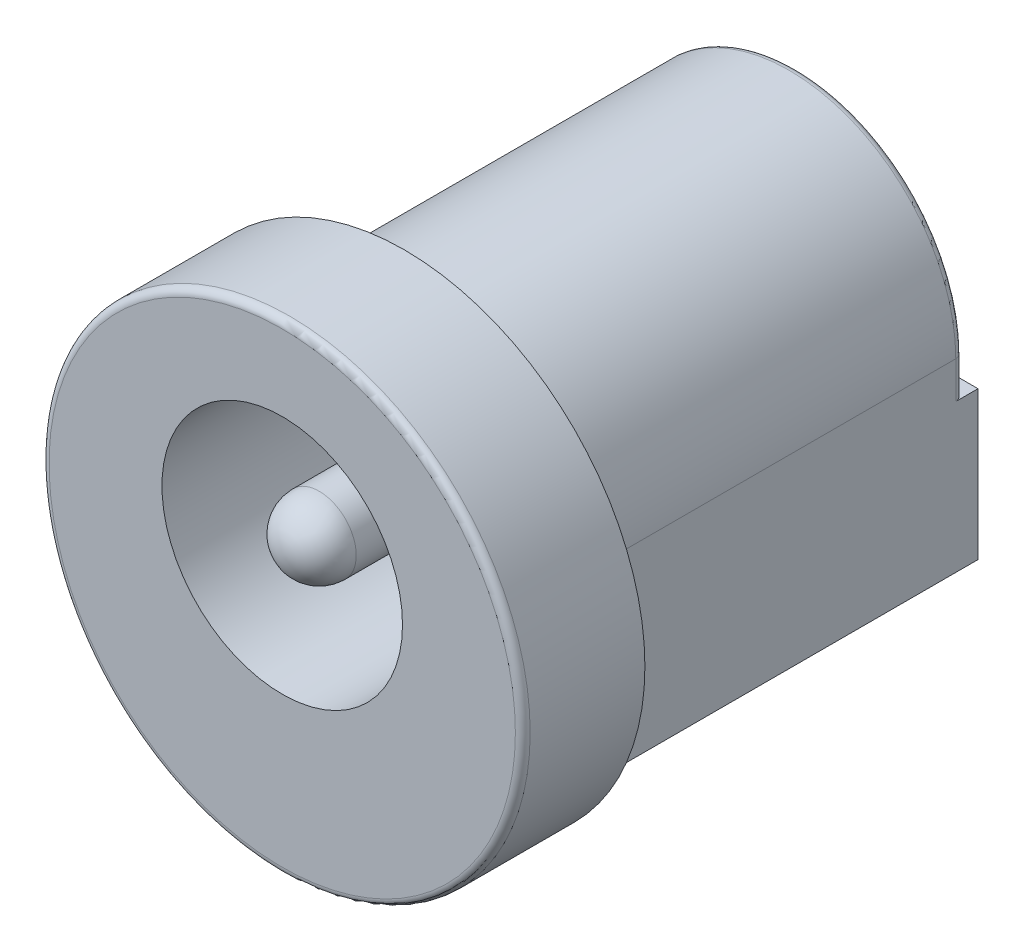
ISO-10303-21;
HEADER;
FILE_DESCRIPTION(('STEP AP214'),'2;1');
FILE_NAME('part.step','',(''),(''),'','','');
FILE_SCHEMA(('AUTOMOTIVE_DESIGN { 1 0 10303 214 1 1 1 1 }'));
ENDSEC;
DATA;
#1=APPLICATION_CONTEXT('core data for automotive mechanical design processes');
#2=APPLICATION_PROTOCOL_DEFINITION('international standard','automotive_design',2000,#1);
#3=PRODUCT_CONTEXT('',#1,'mechanical');
#4=PRODUCT('Part','Part','',(#3));
#5=PRODUCT_RELATED_PRODUCT_CATEGORY('part','',(#4));
#6=PRODUCT_DEFINITION_FORMATION('','',#4);
#7=PRODUCT_DEFINITION_CONTEXT('part definition',#1,'design');
#8=PRODUCT_DEFINITION('design','',#6,#7);
#9=PRODUCT_DEFINITION_SHAPE('','',#8);
#10=(LENGTH_UNIT() NAMED_UNIT(*) SI_UNIT(.MILLI.,.METRE.));
#11=(NAMED_UNIT(*) PLANE_ANGLE_UNIT() SI_UNIT($,.RADIAN.));
#12=(NAMED_UNIT(*) SI_UNIT($,.STERADIAN.) SOLID_ANGLE_UNIT());
#13=UNCERTAINTY_MEASURE_WITH_UNIT(LENGTH_MEASURE(1.E-05),#10,'distance_accuracy_value','');
#14=(GEOMETRIC_REPRESENTATION_CONTEXT(3) GLOBAL_UNCERTAINTY_ASSIGNED_CONTEXT((#13)) GLOBAL_UNIT_ASSIGNED_CONTEXT((#10,
#11,#12)) REPRESENTATION_CONTEXT('',''));
#15=CARTESIAN_POINT('',(0.,0.,0.));
#16=DIRECTION('',(0.,0.,1.));
#17=DIRECTION('',(1.,0.,0.));
#18=AXIS2_PLACEMENT_3D('',#15,#16,#17);
#19=CARTESIAN_POINT('',(-1.1,-5.14523929829065,-7.7));
#20=DIRECTION('',(0.,1.,0.));
#21=DIRECTION('',(0.,0.,1.));
#22=AXIS2_PLACEMENT_3D('',#19,#20,#21);
#23=PLANE('',#22);
#24=DIRECTION('',(1.,0.,0.));
#25=VECTOR('',#24,1.);
#26=CARTESIAN_POINT('',(-1.1,-5.14523929829065,-8.1));
#27=LINE('',#26,#25);
#28=CARTESIAN_POINT('',(-1.1,-5.14523929829065,-8.1));
#29=VERTEX_POINT('',#28);
#30=CARTESIAN_POINT('',(1.1,-5.14523929829065,-8.1));
#31=VERTEX_POINT('',#30);
#32=EDGE_CURVE('E114',#29,#31,#27,.T.);
#33=ORIENTED_EDGE('',*,*,#32,.F.);
#34=DIRECTION('',(0.,0.,-1.));
#35=VECTOR('',#34,1.);
#36=CARTESIAN_POINT('',(-1.1,-5.14523929829065,-7.7));
#37=LINE('',#36,#35);
#38=CARTESIAN_POINT('',(-1.1,-5.14523929829065,-7.7));
#39=VERTEX_POINT('',#38);
#40=EDGE_CURVE('E12',#39,#29,#37,.T.);
#41=ORIENTED_EDGE('',*,*,#40,.F.);
#42=DIRECTION('',(1.,0.,0.));
#43=VECTOR('',#42,1.);
#44=CARTESIAN_POINT('',(-1.1,-5.14523929829065,-7.7));
#45=LINE('',#44,#43);
#46=CARTESIAN_POINT('',(1.1,-5.14523929829065,-7.7));
#47=VERTEX_POINT('',#46);
#48=EDGE_CURVE('E107',#39,#47,#45,.T.);
#49=ORIENTED_EDGE('',*,*,#48,.T.);
#50=DIRECTION('',(0.,0.,-1.));
#51=VECTOR('',#50,1.);
#52=CARTESIAN_POINT('',(1.1,-5.14523929829065,-7.7));
#53=LINE('',#52,#51);
#54=EDGE_CURVE('E52',#47,#31,#53,.T.);
#55=ORIENTED_EDGE('',*,*,#54,.T.);
#56=EDGE_LOOP('',(#33,#41,#49,#55));
#57=FACE_BOUND('',#56,.T.);
#58=ADVANCED_FACE('F49',(#57),#23,.T.);
#59=CARTESIAN_POINT('',(-1.1,-6.9,-7.7));
#60=DIRECTION('',(-1.,0.,0.));
#61=DIRECTION('',(0.,0.,1.));
#62=AXIS2_PLACEMENT_3D('',#59,#60,#61);
#63=PLANE('',#62);
#64=DIRECTION('',(0.,1.,0.));
#65=VECTOR('',#64,1.);
#66=CARTESIAN_POINT('',(-1.1,-6.9,-8.1));
#67=LINE('',#66,#65);
#68=CARTESIAN_POINT('',(-1.1,-6.9,-8.1));
#69=VERTEX_POINT('',#68);
#70=EDGE_CURVE('E109',#69,#29,#67,.T.);
#71=ORIENTED_EDGE('',*,*,#70,.F.);
#72=DIRECTION('',(0.,0.,-1.));
#73=VECTOR('',#72,1.);
#74=CARTESIAN_POINT('',(-1.1,-6.9,-7.7));
#75=LINE('',#74,#73);
#76=CARTESIAN_POINT('',(-1.1,-6.9,-7.7));
#77=VERTEX_POINT('',#76);
#78=EDGE_CURVE('E58',#77,#69,#75,.T.);
#79=ORIENTED_EDGE('',*,*,#78,.F.);
#80=DIRECTION('',(0.,1.,0.));
#81=VECTOR('',#80,1.);
#82=CARTESIAN_POINT('',(-1.1,-6.9,-7.7));
#83=LINE('',#82,#81);
#84=EDGE_CURVE('E104',#77,#39,#83,.T.);
#85=ORIENTED_EDGE('',*,*,#84,.T.);
#86=ORIENTED_EDGE('',*,*,#40,.T.);
#87=EDGE_LOOP('',(#71,#79,#85,#86));
#88=FACE_BOUND('',#87,.T.);
#89=ADVANCED_FACE('F125',(#88),#63,.T.);
#90=CARTESIAN_POINT('',(0.,-6.9,-7.7));
#91=DIRECTION('',(0.,0.,-1.));
#92=DIRECTION('',(-1.,0.,0.));
#93=AXIS2_PLACEMENT_3D('',#90,#91,#92);
#94=CYLINDRICAL_SURFACE('',#93,1.1);
#95=CARTESIAN_POINT('',(0.,-6.9,-8.1));
#96=DIRECTION('',(0.,0.,-1.));
#97=DIRECTION('',(-1.,0.,0.));
#98=AXIS2_PLACEMENT_3D('',#95,#96,#97);
#99=CIRCLE('',#98,1.1);
#100=CARTESIAN_POINT('',(1.1,-6.9,-8.1));
#101=VERTEX_POINT('',#100);
#102=EDGE_CURVE('E99',#101,#69,#99,.T.);
#103=ORIENTED_EDGE('',*,*,#102,.F.);
#104=DIRECTION('',(0.,0.,-1.));
#105=VECTOR('',#104,1.);
#106=CARTESIAN_POINT('',(1.1,-6.9,-7.7));
#107=LINE('',#106,#105);
#108=CARTESIAN_POINT('',(1.1,-6.9,-7.7));
#109=VERTEX_POINT('',#108);
#110=EDGE_CURVE('E94',#109,#101,#107,.T.);
#111=ORIENTED_EDGE('',*,*,#110,.F.);
#112=CARTESIAN_POINT('',(0.,-6.9,-7.7));
#113=DIRECTION('',(0.,0.,-1.));
#114=DIRECTION('',(-1.,0.,0.));
#115=AXIS2_PLACEMENT_3D('',#112,#113,#114);
#116=CIRCLE('',#115,1.1);
#117=EDGE_CURVE('E97',#109,#77,#116,.T.);
#118=ORIENTED_EDGE('',*,*,#117,.T.);
#119=ORIENTED_EDGE('',*,*,#78,.T.);
#120=EDGE_LOOP('',(#103,#111,#118,#119));
#121=FACE_BOUND('',#120,.T.);
#122=ADVANCED_FACE('F96',(#121),#94,.T.);
#123=CARTESIAN_POINT('',(1.1,-5.14523929829065,-7.7));
#124=DIRECTION('',(1.,0.,0.));
#125=DIRECTION('',(0.,1.,0.));
#126=AXIS2_PLACEMENT_3D('',#123,#124,#125);
#127=PLANE('',#126);
#128=DIRECTION('',(0.,-1.,0.));
#129=VECTOR('',#128,1.);
#130=CARTESIAN_POINT('',(1.1,-5.14523929829065,-8.1));
#131=LINE('',#130,#129);
#132=EDGE_CURVE('E117',#31,#101,#131,.T.);
#133=ORIENTED_EDGE('',*,*,#132,.F.);
#134=ORIENTED_EDGE('',*,*,#54,.F.);
#135=DIRECTION('',(0.,-1.,0.));
#136=VECTOR('',#135,1.);
#137=CARTESIAN_POINT('',(1.1,-5.14523929829065,-7.7));
#138=LINE('',#137,#136);
#139=EDGE_CURVE('E103',#47,#109,#138,.T.);
#140=ORIENTED_EDGE('',*,*,#139,.T.);
#141=ORIENTED_EDGE('',*,*,#110,.T.);
#142=EDGE_LOOP('',(#133,#134,#140,#141));
#143=FACE_BOUND('',#142,.T.);
#144=ADVANCED_FACE('F106',(#143),#127,.T.);
#145=CARTESIAN_POINT('',(0.,-6.9,-7.7));
#146=DIRECTION('',(0.,0.,-1.));
#147=DIRECTION('',(-1.,0.,0.));
#148=AXIS2_PLACEMENT_3D('',#145,#146,#147);
#149=PLANE('',#148);
#150=CARTESIAN_POINT('',(0.,-6.9,-7.7));
#151=DIRECTION('',(0.,0.,-1.));
#152=DIRECTION('',(-1.,0.,0.));
#153=AXIS2_PLACEMENT_3D('',#150,#151,#152);
#154=CIRCLE('',#153,0.5);
#155=CARTESIAN_POINT('',(-0.5,-6.9,-7.7));
#156=VERTEX_POINT('',#155);
#157=EDGE_CURVE('E118',#156,#156,#154,.T.);
#158=ORIENTED_EDGE('',*,*,#157,.T.);
#159=EDGE_LOOP('',(#158));
#160=FACE_BOUND('',#159,.T.);
#161=ORIENTED_EDGE('',*,*,#48,.F.);
#162=ORIENTED_EDGE('',*,*,#84,.F.);
#163=ORIENTED_EDGE('',*,*,#117,.F.);
#164=ORIENTED_EDGE('',*,*,#139,.F.);
#165=EDGE_LOOP('',(#161,#162,#163,#164));
#166=FACE_BOUND('',#165,.T.);
#167=ADVANCED_FACE('F102',(#160,#166),#149,.F.);
#168=CARTESIAN_POINT('',(0.,-6.9,-8.1));
#169=DIRECTION('',(0.,0.,-1.));
#170=DIRECTION('',(-1.,0.,0.));
#171=AXIS2_PLACEMENT_3D('',#168,#169,#170);
#172=PLANE('',#171);
#173=CARTESIAN_POINT('',(0.,-6.9,-8.1));
#174=DIRECTION('',(0.,0.,-1.));
#175=DIRECTION('',(-1.,0.,0.));
#176=AXIS2_PLACEMENT_3D('',#173,#174,#175);
#177=CIRCLE('',#176,0.5);
#178=CARTESIAN_POINT('',(-0.5,-6.9,-8.1));
#179=VERTEX_POINT('',#178);
#180=EDGE_CURVE('E155',#179,#179,#177,.T.);
#181=ORIENTED_EDGE('',*,*,#180,.F.);
#182=EDGE_LOOP('',(#181));
#183=FACE_BOUND('',#182,.T.);
#184=ORIENTED_EDGE('',*,*,#32,.T.);
#185=ORIENTED_EDGE('',*,*,#132,.T.);
#186=ORIENTED_EDGE('',*,*,#102,.T.);
#187=ORIENTED_EDGE('',*,*,#70,.T.);
#188=EDGE_LOOP('',(#184,#185,#186,#187));
#189=FACE_BOUND('',#188,.T.);
#190=ADVANCED_FACE('F124',(#183,#189),#172,.T.);
#191=CARTESIAN_POINT('',(0.,-6.9,-7.7));
#192=DIRECTION('',(0.,0.,-1.));
#193=DIRECTION('',(-1.,0.,0.));
#194=AXIS2_PLACEMENT_3D('',#191,#192,#193);
#195=CYLINDRICAL_SURFACE('',#194,0.5);
#196=ORIENTED_EDGE('',*,*,#157,.F.);
#197=EDGE_LOOP('',(#196));
#198=FACE_BOUND('',#197,.T.);
#199=ORIENTED_EDGE('',*,*,#180,.T.);
#200=EDGE_LOOP('',(#199));
#201=FACE_BOUND('',#200,.T.);
#202=ADVANCED_FACE('F143',(#198,#201),#195,.F.);
#203=CLOSED_SHELL('',(#58,#89,#122,#144,#167,#190,#202));
#204=MANIFOLD_SOLID_BREP('B2',#203);
#205=CARTESIAN_POINT('',(0.,0.999999999999999,-11.));
#206=DIRECTION('',(0.,0.,1.));
#207=DIRECTION('',(1.,0.,0.));
#208=AXIS2_PLACEMENT_3D('',#205,#206,#207);
#209=CYLINDRICAL_SURFACE('',#208,3.25);
#210=CARTESIAN_POINT('',(0.,0.999999999999999,0.));
#211=DIRECTION('',(0.,0.,1.));
#212=DIRECTION('',(1.,0.,0.));
#213=AXIS2_PLACEMENT_3D('',#210,#211,#212);
#214=CIRCLE('',#213,3.25);
#215=CARTESIAN_POINT('',(3.25,0.999999999999999,0.));
#216=VERTEX_POINT('',#215);
#217=EDGE_CURVE('E489',#216,#216,#214,.T.);
#218=ORIENTED_EDGE('',*,*,#217,.T.);
#219=EDGE_LOOP('',(#218));
#220=FACE_BOUND('',#219,.T.);
#221=DIRECTION('',(0.,0.,1.));
#222=VECTOR('',#221,1.);
#223=CARTESIAN_POINT('',(1.4,-1.93300187521249,-11.));
#224=LINE('',#223,#222);
#225=CARTESIAN_POINT('',(1.4,-1.93300187521249,-4.6));
#226=VERTEX_POINT('',#225);
#227=CARTESIAN_POINT('',(1.4,-1.93300187521249,-11.));
#228=VERTEX_POINT('',#227);
#229=EDGE_CURVE('E389',#226,#228,#224,.F.);
#230=ORIENTED_EDGE('',*,*,#229,.F.);
#231=CARTESIAN_POINT('',(0.,0.999999999999999,-4.6));
#232=DIRECTION('',(0.,0.,-1.));
#233=DIRECTION('',(-1.,0.,0.));
#234=AXIS2_PLACEMENT_3D('',#231,#232,#233);
#235=CIRCLE('',#234,3.25);
#236=CARTESIAN_POINT('',(-1.4,-1.93300187521249,-4.6));
#237=VERTEX_POINT('',#236);
#238=EDGE_CURVE('E368',#237,#226,#235,.F.);
#239=ORIENTED_EDGE('',*,*,#238,.F.);
#240=DIRECTION('',(0.,0.,1.));
#241=VECTOR('',#240,1.);
#242=CARTESIAN_POINT('',(-1.4,-1.93300187521249,-11.));
#243=LINE('',#242,#241);
#244=CARTESIAN_POINT('',(-1.4,-1.93300187521249,-11.));
#245=VERTEX_POINT('',#244);
#246=EDGE_CURVE('E387',#245,#237,#243,.T.);
#247=ORIENTED_EDGE('',*,*,#246,.F.);
#248=CARTESIAN_POINT('',(0.,0.999999999999999,-11.));
#249=DIRECTION('',(0.,0.,1.));
#250=DIRECTION('',(1.,0.,0.));
#251=AXIS2_PLACEMENT_3D('',#248,#249,#250);
#252=CIRCLE('',#251,3.25);
#253=EDGE_CURVE('E490',#228,#245,#252,.T.);
#254=ORIENTED_EDGE('',*,*,#253,.F.);
#255=EDGE_LOOP('',(#230,#239,#247,#254));
#256=FACE_BOUND('',#255,.T.);
#257=ADVANCED_FACE('F208',(#220,#256),#209,.F.);
#258=CARTESIAN_POINT('',(0.,0.999999999999999,-11.));
#259=DIRECTION('',(0.,0.,1.));
#260=DIRECTION('',(1.,0.,0.));
#261=AXIS2_PLACEMENT_3D('',#258,#259,#260);
#262=PLANE('',#261);
#263=CARTESIAN_POINT('',(0.,0.999999999999999,-11.));
#264=DIRECTION('',(0.,0.,1.));
#265=DIRECTION('',(1.,0.,0.));
#266=AXIS2_PLACEMENT_3D('',#263,#264,#265);
#267=CIRCLE('',#266,1.);
#268=CARTESIAN_POINT('',(1.,0.999999999999999,-11.));
#269=VERTEX_POINT('',#268);
#270=EDGE_CURVE('E480',#269,#269,#267,.T.);
#271=ORIENTED_EDGE('',*,*,#270,.F.);
#272=EDGE_LOOP('',(#271));
#273=FACE_BOUND('',#272,.T.);
#274=DIRECTION('',(-1.,0.,0.));
#275=VECTOR('',#274,1.);
#276=CARTESIAN_POINT('',(-1.4,-1.75,-11.));
#277=LINE('',#276,#275);
#278=CARTESIAN_POINT('',(1.4,-1.75,-11.));
#279=VERTEX_POINT('',#278);
#280=CARTESIAN_POINT('',(-1.4,-1.75,-11.));
#281=VERTEX_POINT('',#280);
#282=EDGE_CURVE('E563',#279,#281,#277,.T.);
#283=ORIENTED_EDGE('',*,*,#282,.F.);
#284=DIRECTION('',(0.,-1.,0.));
#285=VECTOR('',#284,1.);
#286=CARTESIAN_POINT('',(1.4,0.999999999999999,-11.));
#287=LINE('',#286,#285);
#288=EDGE_CURVE('E386',#279,#228,#287,.T.);
#289=ORIENTED_EDGE('',*,*,#288,.T.);
#290=ORIENTED_EDGE('',*,*,#253,.T.);
#291=DIRECTION('',(0.,-1.,0.));
#292=VECTOR('',#291,1.);
#293=CARTESIAN_POINT('',(-1.4,-2.75,-11.));
#294=LINE('',#293,#292);
#295=EDGE_CURVE('E372',#281,#245,#294,.T.);
#296=ORIENTED_EDGE('',*,*,#295,.F.);
#297=EDGE_LOOP('',(#283,#289,#290,#296));
#298=FACE_BOUND('',#297,.T.);
#299=ADVANCED_FACE('F581',(#273,#298),#262,.T.);
#300=CARTESIAN_POINT('',(0.,0.,-13.9));
#301=DIRECTION('',(0.,0.,-1.));
#302=DIRECTION('',(-1.,0.,0.));
#303=AXIS2_PLACEMENT_3D('',#300,#301,#302);
#304=PLANE('',#303);
#305=CARTESIAN_POINT('',(0.,0.999999999999998,-13.9));
#306=DIRECTION('',(0.,0.,-1.));
#307=DIRECTION('',(-1.,0.,0.));
#308=AXIS2_PLACEMENT_3D('',#305,#306,#307);
#309=CIRCLE('',#308,1.9);
#310=CARTESIAN_POINT('',(1.2,-0.473091986265626,-13.9));
#311=VERTEX_POINT('',#310);
#312=CARTESIAN_POINT('',(1.1,-0.549193338482969,-13.9));
#313=VERTEX_POINT('',#312);
#314=EDGE_CURVE('E401',#311,#313,#309,.T.);
#315=ORIENTED_EDGE('',*,*,#314,.F.);
#316=DIRECTION('',(0.,-1.,0.));
#317=VECTOR('',#316,1.);
#318=CARTESIAN_POINT('',(1.2,0.,-13.9));
#319=LINE('',#318,#317);
#320=CARTESIAN_POINT('',(1.2,-4.,-13.9));
#321=VERTEX_POINT('',#320);
#322=EDGE_CURVE('E455',#311,#321,#319,.T.);
#323=ORIENTED_EDGE('',*,*,#322,.T.);
#324=DIRECTION('',(-1.,0.,0.));
#325=VECTOR('',#324,1.);
#326=CARTESIAN_POINT('',(1.2,-4.,-13.9));
#327=LINE('',#326,#325);
#328=CARTESIAN_POINT('',(1.1,-4.,-13.9));
#329=VERTEX_POINT('',#328);
#330=EDGE_CURVE('E459',#321,#329,#327,.T.);
#331=ORIENTED_EDGE('',*,*,#330,.T.);
#332=DIRECTION('',(0.,-1.,0.));
#333=VECTOR('',#332,1.);
#334=CARTESIAN_POINT('',(1.1,-6.9,-13.9));
#335=LINE('',#334,#333);
#336=EDGE_CURVE('E434',#313,#329,#335,.T.);
#337=ORIENTED_EDGE('',*,*,#336,.F.);
#338=EDGE_LOOP('',(#315,#323,#331,#337));
#339=FACE_BOUND('',#338,.T.);
#340=ADVANCED_FACE('F587',(#339),#304,.T.);
#341=CARTESIAN_POINT('',(-1.1,-0.549193338482969,-13.9));
#342=VERTEX_POINT('',#341);
#343=CARTESIAN_POINT('',(-1.2,-0.473091986265625,-13.9));
#344=VERTEX_POINT('',#343);
#345=EDGE_CURVE('E399',#342,#344,#309,.T.);
#346=ORIENTED_EDGE('',*,*,#345,.F.);
#347=DIRECTION('',(0.,-1.,0.));
#348=VECTOR('',#347,1.);
#349=CARTESIAN_POINT('',(-1.1,0.,-13.9));
#350=LINE('',#349,#348);
#351=CARTESIAN_POINT('',(-1.1,-4.,-13.9));
#352=VERTEX_POINT('',#351);
#353=EDGE_CURVE('E535',#342,#352,#350,.T.);
#354=ORIENTED_EDGE('',*,*,#353,.T.);
#355=CARTESIAN_POINT('',(-1.2,-4.,-13.9));
#356=VERTEX_POINT('',#355);
#357=EDGE_CURVE('E458',#352,#356,#327,.T.);
#358=ORIENTED_EDGE('',*,*,#357,.T.);
#359=DIRECTION('',(0.,1.,0.));
#360=VECTOR('',#359,1.);
#361=CARTESIAN_POINT('',(-1.2,-4.,-13.9));
#362=LINE('',#361,#360);
#363=EDGE_CURVE('E462',#356,#344,#362,.T.);
#364=ORIENTED_EDGE('',*,*,#363,.T.);
#365=EDGE_LOOP('',(#346,#354,#358,#364));
#366=FACE_BOUND('',#365,.T.);
#367=ADVANCED_FACE('F603',(#366),#304,.T.);
#368=CARTESIAN_POINT('',(0.,0.999999999999998,-14.3));
#369=DIRECTION('',(0.,0.,1.));
#370=DIRECTION('',(1.,0.,0.));
#371=AXIS2_PLACEMENT_3D('',#368,#369,#370);
#372=CYLINDRICAL_SURFACE('',#371,4.5);
#373=DIRECTION('',(0.,0.,1.));
#374=VECTOR('',#373,1.);
#375=CARTESIAN_POINT('',(4.5,0.999999999999999,-14.3));
#376=LINE('',#375,#374);
#377=CARTESIAN_POINT('',(4.5,0.999999999999999,-13.7));
#378=VERTEX_POINT('',#377);
#379=CARTESIAN_POINT('',(4.5,0.999999999999999,-3.3));
#380=VERTEX_POINT('',#379);
#381=EDGE_CURVE('E506',#378,#380,#376,.T.);
#382=ORIENTED_EDGE('',*,*,#381,.F.);
#383=CARTESIAN_POINT('',(0.,0.999999999999998,-13.7));
#384=DIRECTION('',(0.,0.,-1.));
#385=DIRECTION('',(-1.,0.,0.));
#386=AXIS2_PLACEMENT_3D('',#383,#384,#385);
#387=CIRCLE('',#386,4.5);
#388=CARTESIAN_POINT('',(-4.5,0.999999999999999,-13.7));
#389=VERTEX_POINT('',#388);
#390=EDGE_CURVE('E553',#378,#389,#387,.F.);
#391=ORIENTED_EDGE('',*,*,#390,.T.);
#392=DIRECTION('',(0.,0.,1.));
#393=VECTOR('',#392,1.);
#394=CARTESIAN_POINT('',(-4.5,0.999999999999999,-14.3));
#395=LINE('',#394,#393);
#396=CARTESIAN_POINT('',(-4.5,0.999999999999999,-3.3));
#397=VERTEX_POINT('',#396);
#398=EDGE_CURVE('E518',#389,#397,#395,.T.);
#399=ORIENTED_EDGE('',*,*,#398,.T.);
#400=CARTESIAN_POINT('',(0.,0.999999999999998,-3.3));
#401=DIRECTION('',(0.,0.,-1.));
#402=DIRECTION('',(-1.,0.,0.));
#403=AXIS2_PLACEMENT_3D('',#400,#401,#402);
#404=CIRCLE('',#403,4.5);
#405=EDGE_CURVE('E499',#397,#380,#404,.T.);
#406=ORIENTED_EDGE('',*,*,#405,.T.);
#407=EDGE_LOOP('',(#382,#391,#399,#406));
#408=FACE_BOUND('',#407,.T.);
#409=ADVANCED_FACE('F599',(#408),#372,.T.);
#410=CARTESIAN_POINT('',(0.,0.,-3.3));
#411=DIRECTION('',(0.,0.,1.));
#412=DIRECTION('',(1.,0.,0.));
#413=AXIS2_PLACEMENT_3D('',#410,#411,#412);
#414=PLANE('',#413);
#415=CARTESIAN_POINT('',(0.,0.,-3.3));
#416=DIRECTION('',(0.,0.,1.));
#417=DIRECTION('',(1.,0.,0.));
#418=AXIS2_PLACEMENT_3D('',#415,#416,#417);
#419=CIRCLE('',#418,6.5);
#420=CARTESIAN_POINT('',(6.5,0.,-3.3));
#421=VERTEX_POINT('',#420);
#422=EDGE_CURVE('E526',#421,#421,#419,.T.);
#423=ORIENTED_EDGE('',*,*,#422,.F.);
#424=EDGE_LOOP('',(#423));
#425=FACE_BOUND('',#424,.T.);
#426=DIRECTION('',(0.,-1.,0.));
#427=VECTOR('',#426,1.);
#428=CARTESIAN_POINT('',(4.5,0.999999999999998,-3.3));
#429=LINE('',#428,#427);
#430=CARTESIAN_POINT('',(4.5,-4.,-3.3));
#431=VERTEX_POINT('',#430);
#432=EDGE_CURVE('E493',#380,#431,#429,.T.);
#433=ORIENTED_EDGE('',*,*,#432,.F.);
#434=ORIENTED_EDGE('',*,*,#405,.F.);
#435=DIRECTION('',(0.,1.,0.));
#436=VECTOR('',#435,1.);
#437=CARTESIAN_POINT('',(-4.5,-4.,-3.3));
#438=LINE('',#437,#436);
#439=CARTESIAN_POINT('',(-4.5,-4.,-3.3));
#440=VERTEX_POINT('',#439);
#441=EDGE_CURVE('E512',#440,#397,#438,.T.);
#442=ORIENTED_EDGE('',*,*,#441,.F.);
#443=DIRECTION('',(-1.,0.,0.));
#444=VECTOR('',#443,1.);
#445=CARTESIAN_POINT('',(4.5,-4.,-3.3));
#446=LINE('',#445,#444);
#447=EDGE_CURVE('E509',#431,#440,#446,.T.);
#448=ORIENTED_EDGE('',*,*,#447,.F.);
#449=EDGE_LOOP('',(#433,#434,#442,#448));
#450=FACE_BOUND('',#449,.T.);
#451=ADVANCED_FACE('F602',(#425,#450),#414,.F.);
#452=CARTESIAN_POINT('',(0.,0.,-3.3));
#453=DIRECTION('',(0.,0.,1.));
#454=DIRECTION('',(1.,0.,0.));
#455=AXIS2_PLACEMENT_3D('',#452,#453,#454);
#456=CYLINDRICAL_SURFACE('',#455,6.5);
#457=CARTESIAN_POINT('',(0.,0.,-0.2));
#458=DIRECTION('',(0.,0.,1.));
#459=DIRECTION('',(1.,0.,0.));
#460=AXIS2_PLACEMENT_3D('',#457,#458,#459);
#461=CIRCLE('',#460,6.5);
#462=CARTESIAN_POINT('',(6.5,0.,-0.2));
#463=VERTEX_POINT('',#462);
#464=EDGE_CURVE('E47',#463,#463,#461,.F.);
#465=ORIENTED_EDGE('',*,*,#464,.T.);
#466=EDGE_LOOP('',(#465));
#467=FACE_BOUND('',#466,.T.);
#468=ORIENTED_EDGE('',*,*,#422,.T.);
#469=EDGE_LOOP('',(#468));
#470=FACE_BOUND('',#469,.T.);
#471=ADVANCED_FACE('F617',(#467,#470),#456,.T.);
#472=CARTESIAN_POINT('',(0.,0.,0.));
#473=DIRECTION('',(0.,0.,1.));
#474=DIRECTION('',(1.,0.,0.));
#475=AXIS2_PLACEMENT_3D('',#472,#473,#474);
#476=PLANE('',#475);
#477=CARTESIAN_POINT('',(0.,0.,0.));
#478=DIRECTION('',(0.,0.,1.));
#479=DIRECTION('',(1.,0.,0.));
#480=AXIS2_PLACEMENT_3D('',#477,#478,#479);
#481=CIRCLE('',#480,6.3);
#482=CARTESIAN_POINT('',(6.3,0.,0.));
#483=VERTEX_POINT('',#482);
#484=EDGE_CURVE('E216',#483,#483,#481,.T.);
#485=ORIENTED_EDGE('',*,*,#484,.T.);
#486=EDGE_LOOP('',(#485));
#487=FACE_BOUND('',#486,.T.);
#488=ORIENTED_EDGE('',*,*,#217,.F.);
#489=EDGE_LOOP('',(#488));
#490=FACE_BOUND('',#489,.T.);
#491=ADVANCED_FACE('F567',(#487,#490),#476,.T.);
#492=CARTESIAN_POINT('',(4.5,0.999999999999998,-14.3));
#493=DIRECTION('',(-1.,0.,0.));
#494=DIRECTION('',(0.,0.,1.));
#495=AXIS2_PLACEMENT_3D('',#492,#493,#494);
#496=PLANE('',#495);
#497=DIRECTION('',(0.,0.,-1.));
#498=VECTOR('',#497,1.);
#499=CARTESIAN_POINT('',(4.5,0.,-13.9));
#500=LINE('',#499,#498);
#501=CARTESIAN_POINT('',(4.5,0.,-13.7));
#502=VERTEX_POINT('',#501);
#503=CARTESIAN_POINT('',(4.5,0.,-14.3));
#504=VERTEX_POINT('',#503);
#505=EDGE_CURVE('E223',#502,#504,#500,.T.);
#506=ORIENTED_EDGE('',*,*,#505,.F.);
#507=DIRECTION('',(0.,-1.,0.));
#508=VECTOR('',#507,1.);
#509=CARTESIAN_POINT('',(4.5,0.999999999999998,-13.7));
#510=LINE('',#509,#508);
#511=EDGE_CURVE('E228',#502,#378,#510,.F.);
#512=ORIENTED_EDGE('',*,*,#511,.T.);
#513=ORIENTED_EDGE('',*,*,#381,.T.);
#514=ORIENTED_EDGE('',*,*,#432,.T.);
#515=DIRECTION('',(0.,0.,1.));
#516=VECTOR('',#515,1.);
#517=CARTESIAN_POINT('',(4.5,-4.,-14.3));
#518=LINE('',#517,#516);
#519=CARTESIAN_POINT('',(4.5,-4.,-14.3));
#520=VERTEX_POINT('',#519);
#521=EDGE_CURVE('E523',#520,#431,#518,.T.);
#522=ORIENTED_EDGE('',*,*,#521,.F.);
#523=DIRECTION('',(0.,-1.,0.));
#524=VECTOR('',#523,1.);
#525=CARTESIAN_POINT('',(4.5,0.999999999999998,-14.3));
#526=LINE('',#525,#524);
#527=EDGE_CURVE('E496',#504,#520,#526,.T.);
#528=ORIENTED_EDGE('',*,*,#527,.F.);
#529=EDGE_LOOP('',(#506,#512,#513,#514,#522,#528));
#530=FACE_BOUND('',#529,.T.);
#531=ADVANCED_FACE('F611',(#530),#496,.F.);
#532=CARTESIAN_POINT('',(4.5,-4.,-14.3));
#533=DIRECTION('',(0.,1.,0.));
#534=DIRECTION('',(0.,0.,1.));
#535=AXIS2_PLACEMENT_3D('',#532,#533,#534);
#536=PLANE('',#535);
#537=DIRECTION('',(-1.,0.,0.));
#538=VECTOR('',#537,1.);
#539=CARTESIAN_POINT('',(4.5,-4.,-14.3));
#540=LINE('',#539,#538);
#541=CARTESIAN_POINT('',(-1.2,-4.,-14.3));
#542=VERTEX_POINT('',#541);
#543=CARTESIAN_POINT('',(-4.5,-4.,-14.3));
#544=VERTEX_POINT('',#543);
#545=EDGE_CURVE('E498',#542,#544,#540,.T.);
#546=ORIENTED_EDGE('',*,*,#545,.F.);
#547=DIRECTION('',(0.,0.,-1.));
#548=VECTOR('',#547,1.);
#549=CARTESIAN_POINT('',(-1.2,-4.,-13.9));
#550=LINE('',#549,#548);
#551=EDGE_CURVE('E481',#356,#542,#550,.T.);
#552=ORIENTED_EDGE('',*,*,#551,.F.);
#553=ORIENTED_EDGE('',*,*,#357,.F.);
#554=EDGE_CURVE('E463',#329,#352,#327,.T.);
#555=ORIENTED_EDGE('',*,*,#554,.F.);
#556=ORIENTED_EDGE('',*,*,#330,.F.);
#557=DIRECTION('',(0.,0.,-1.));
#558=VECTOR('',#557,1.);
#559=CARTESIAN_POINT('',(1.2,-4.,-13.9));
#560=LINE('',#559,#558);
#561=CARTESIAN_POINT('',(1.2,-4.,-14.3));
#562=VERTEX_POINT('',#561);
#563=EDGE_CURVE('E483',#321,#562,#560,.T.);
#564=ORIENTED_EDGE('',*,*,#563,.T.);
#565=EDGE_CURVE('E500',#520,#562,#540,.T.);
#566=ORIENTED_EDGE('',*,*,#565,.F.);
#567=ORIENTED_EDGE('',*,*,#521,.T.);
#568=ORIENTED_EDGE('',*,*,#447,.T.);
#569=DIRECTION('',(0.,0.,1.));
#570=VECTOR('',#569,1.);
#571=CARTESIAN_POINT('',(-4.5,-4.,-14.3));
#572=LINE('',#571,#570);
#573=EDGE_CURVE('E520',#544,#440,#572,.T.);
#574=ORIENTED_EDGE('',*,*,#573,.F.);
#575=EDGE_LOOP('',(#546,#552,#553,#555,#556,#564,#566,#567,#568,#574));
#576=FACE_BOUND('',#575,.T.);
#577=ADVANCED_FACE('F607',(#576),#536,.F.);
#578=CARTESIAN_POINT('',(-4.5,-4.,-14.3));
#579=DIRECTION('',(1.,0.,0.));
#580=DIRECTION('',(0.,1.,0.));
#581=AXIS2_PLACEMENT_3D('',#578,#579,#580);
#582=PLANE('',#581);
#583=ORIENTED_EDGE('',*,*,#398,.F.);
#584=DIRECTION('',(0.,1.,0.));
#585=VECTOR('',#584,1.);
#586=CARTESIAN_POINT('',(-4.5,0.,-13.7));
#587=LINE('',#586,#585);
#588=CARTESIAN_POINT('',(-4.5,0.,-13.7));
#589=VERTEX_POINT('',#588);
#590=EDGE_CURVE('E549',#389,#589,#587,.F.);
#591=ORIENTED_EDGE('',*,*,#590,.T.);
#592=DIRECTION('',(0.,0.,-1.));
#593=VECTOR('',#592,1.);
#594=CARTESIAN_POINT('',(-4.5,0.,-13.9));
#595=LINE('',#594,#593);
#596=CARTESIAN_POINT('',(-4.5,0.,-14.3));
#597=VERTEX_POINT('',#596);
#598=EDGE_CURVE('E477',#589,#597,#595,.T.);
#599=ORIENTED_EDGE('',*,*,#598,.T.);
#600=DIRECTION('',(0.,1.,0.));
#601=VECTOR('',#600,1.);
#602=CARTESIAN_POINT('',(-4.5,-4.,-14.3));
#603=LINE('',#602,#601);
#604=EDGE_CURVE('E503',#544,#597,#603,.T.);
#605=ORIENTED_EDGE('',*,*,#604,.F.);
#606=ORIENTED_EDGE('',*,*,#573,.T.);
#607=ORIENTED_EDGE('',*,*,#441,.T.);
#608=EDGE_LOOP('',(#583,#591,#599,#605,#606,#607));
#609=FACE_BOUND('',#608,.T.);
#610=ADVANCED_FACE('F597',(#609),#582,.F.);
#611=CARTESIAN_POINT('',(0.,0.999999999999998,-14.3));
#612=DIRECTION('',(0.,0.,-1.));
#613=DIRECTION('',(-1.,0.,0.));
#614=AXIS2_PLACEMENT_3D('',#611,#612,#613);
#615=PLANE('',#614);
#616=DIRECTION('',(0.,-1.,0.));
#617=VECTOR('',#616,1.);
#618=CARTESIAN_POINT('',(1.2,0.,-14.3));
#619=LINE('',#618,#617);
#620=CARTESIAN_POINT('',(1.2,-0.473091986265626,-14.3));
#621=VERTEX_POINT('',#620);
#622=EDGE_CURVE('E471',#621,#562,#619,.T.);
#623=ORIENTED_EDGE('',*,*,#622,.F.);
#624=CARTESIAN_POINT('',(0.,0.999999999999998,-14.3));
#625=DIRECTION('',(0.,0.,-1.));
#626=DIRECTION('',(-1.,0.,0.));
#627=AXIS2_PLACEMENT_3D('',#624,#625,#626);
#628=CIRCLE('',#627,1.9);
#629=CARTESIAN_POINT('',(1.1,-0.549193338482969,-14.3));
#630=VERTEX_POINT('',#629);
#631=EDGE_CURVE('E400',#621,#630,#628,.T.);
#632=ORIENTED_EDGE('',*,*,#631,.T.);
#633=DIRECTION('',(0.,-1.,0.));
#634=VECTOR('',#633,1.);
#635=CARTESIAN_POINT('',(1.1,-6.9,-14.3));
#636=LINE('',#635,#634);
#637=CARTESIAN_POINT('',(1.1,-6.9,-14.3));
#638=VERTEX_POINT('',#637);
#639=EDGE_CURVE('E437',#630,#638,#636,.T.);
#640=ORIENTED_EDGE('',*,*,#639,.T.);
#641=CARTESIAN_POINT('',(0.,-6.9,-14.3));
#642=DIRECTION('',(0.,0.,-1.));
#643=DIRECTION('',(-1.,0.,0.));
#644=AXIS2_PLACEMENT_3D('',#641,#642,#643);
#645=CIRCLE('',#644,1.1);
#646=CARTESIAN_POINT('',(-1.1,-6.9,-14.3));
#647=VERTEX_POINT('',#646);
#648=EDGE_CURVE('E430',#638,#647,#645,.T.);
#649=ORIENTED_EDGE('',*,*,#648,.T.);
#650=DIRECTION('',(0.,1.,0.));
#651=VECTOR('',#650,1.);
#652=CARTESIAN_POINT('',(-1.1,-6.9,-14.3));
#653=LINE('',#652,#651);
#654=CARTESIAN_POINT('',(-1.1,-0.549193338482969,-14.3));
#655=VERTEX_POINT('',#654);
#656=EDGE_CURVE('E433',#647,#655,#653,.T.);
#657=ORIENTED_EDGE('',*,*,#656,.T.);
#658=CARTESIAN_POINT('',(-1.2,-0.473091986265625,-14.3));
#659=VERTEX_POINT('',#658);
#660=EDGE_CURVE('E404',#655,#659,#628,.T.);
#661=ORIENTED_EDGE('',*,*,#660,.T.);
#662=DIRECTION('',(0.,1.,0.));
#663=VECTOR('',#662,1.);
#664=CARTESIAN_POINT('',(-1.2,-4.,-14.3));
#665=LINE('',#664,#663);
#666=EDGE_CURVE('E473',#542,#659,#665,.T.);
#667=ORIENTED_EDGE('',*,*,#666,.F.);
#668=ORIENTED_EDGE('',*,*,#545,.T.);
#669=ORIENTED_EDGE('',*,*,#604,.T.);
#670=DIRECTION('',(-1.,0.,0.));
#671=VECTOR('',#670,1.);
#672=CARTESIAN_POINT('',(-4.5,0.,-14.3));
#673=LINE('',#672,#671);
#674=CARTESIAN_POINT('',(-1.61554944214035,0.,-14.3));
#675=VERTEX_POINT('',#674);
#676=EDGE_CURVE('E456',#675,#597,#673,.T.);
#677=ORIENTED_EDGE('',*,*,#676,.F.);
#678=CARTESIAN_POINT('',(1.61554944214035,0.,-14.3));
#679=VERTEX_POINT('',#678);
#680=EDGE_CURVE('E395',#675,#679,#628,.T.);
#681=ORIENTED_EDGE('',*,*,#680,.T.);
#682=DIRECTION('',(-1.,0.,0.));
#683=VECTOR('',#682,1.);
#684=CARTESIAN_POINT('',(1.2,0.,-14.3));
#685=LINE('',#684,#683);
#686=EDGE_CURVE('E452',#504,#679,#685,.T.);
#687=ORIENTED_EDGE('',*,*,#686,.F.);
#688=ORIENTED_EDGE('',*,*,#527,.T.);
#689=ORIENTED_EDGE('',*,*,#565,.T.);
#690=EDGE_LOOP('',(#623,#632,#640,#649,#657,#661,#667,#668,#669,#677,#681,#687,#688,#689));
#691=FACE_BOUND('',#690,.T.);
#692=CARTESIAN_POINT('',(0.,-6.9,-14.3));
#693=DIRECTION('',(0.,0.,-1.));
#694=DIRECTION('',(-1.,0.,0.));
#695=AXIS2_PLACEMENT_3D('',#692,#693,#694);
#696=CIRCLE('',#695,0.5);
#697=CARTESIAN_POINT('',(-0.5,-6.9,-14.3));
#698=VERTEX_POINT('',#697);
#699=EDGE_CURVE('E421',#698,#698,#696,.T.);
#700=ORIENTED_EDGE('',*,*,#699,.F.);
#701=EDGE_LOOP('',(#700));
#702=FACE_BOUND('',#701,.T.);
#703=CARTESIAN_POINT('',(0.,0.999999999999998,-14.3));
#704=DIRECTION('',(0.,0.,-1.));
#705=DIRECTION('',(-1.,0.,0.));
#706=AXIS2_PLACEMENT_3D('',#703,#704,#705);
#707=CIRCLE('',#706,0.5);
#708=CARTESIAN_POINT('',(-0.5,0.999999999999998,-14.3));
#709=VERTEX_POINT('',#708);
#710=EDGE_CURVE('E424',#709,#709,#707,.T.);
#711=ORIENTED_EDGE('',*,*,#710,.F.);
#712=EDGE_LOOP('',(#711));
#713=FACE_BOUND('',#712,.T.);
#714=ADVANCED_FACE('F593',(#691,#702,#713),#615,.T.);
#715=CARTESIAN_POINT('',(0.,0.999999999999999,0.));
#716=DIRECTION('',(0.,0.,-1.));
#717=DIRECTION('',(-1.,0.,0.));
#718=AXIS2_PLACEMENT_3D('',#715,#716,#717);
#719=CYLINDRICAL_SURFACE('',#718,1.);
#720=CARTESIAN_POINT('',(0.,0.999999999999999,-1.));
#721=DIRECTION('',(0.,0.,-1.));
#722=DIRECTION('',(-1.,0.,0.));
#723=AXIS2_PLACEMENT_3D('',#720,#721,#722);
#724=CIRCLE('',#723,1.);
#725=CARTESIAN_POINT('',(-1.,0.999999999999999,-1.));
#726=VERTEX_POINT('',#725);
#727=EDGE_CURVE('E529',#726,#726,#724,.T.);
#728=ORIENTED_EDGE('',*,*,#727,.T.);
#729=EDGE_LOOP('',(#728));
#730=FACE_BOUND('',#729,.T.);
#731=ORIENTED_EDGE('',*,*,#270,.T.);
#732=EDGE_LOOP('',(#731));
#733=FACE_BOUND('',#732,.T.);
#734=ADVANCED_FACE('F596',(#730,#733),#719,.T.);
#735=CARTESIAN_POINT('',(0.,0.999999999999999,-1.));
#736=DIRECTION('',(0.,0.,1.));
#737=DIRECTION('',(1.,0.,0.));
#738=AXIS2_PLACEMENT_3D('',#735,#736,#737);
#739=SPHERICAL_SURFACE('',#738,1.);
#740=ORIENTED_EDGE('',*,*,#727,.F.);
#741=EDGE_LOOP('',(#740));
#742=FACE_BOUND('',#741,.T.);
#743=ADVANCED_FACE('F624',(#742),#739,.T.);
#744=DIRECTION('',(-1.,0.,0.));
#745=VECTOR('',#744,1.);
#746=CARTESIAN_POINT('',(-4.5,0.,-13.9));
#747=LINE('',#746,#745);
#748=CARTESIAN_POINT('',(-1.61554944214035,0.,-13.9));
#749=VERTEX_POINT('',#748);
#750=CARTESIAN_POINT('',(-4.3,0.,-13.9));
#751=VERTEX_POINT('',#750);
#752=EDGE_CURVE('E466',#749,#751,#747,.T.);
#753=ORIENTED_EDGE('',*,*,#752,.T.);
#754=DIRECTION('',(0.,1.,0.));
#755=VECTOR('',#754,1.);
#756=CARTESIAN_POINT('',(-4.3,1.,-13.9));
#757=LINE('',#756,#755);
#758=CARTESIAN_POINT('',(-4.3,0.999999999999999,-13.9));
#759=VERTEX_POINT('',#758);
#760=EDGE_CURVE('E546',#751,#759,#757,.T.);
#761=ORIENTED_EDGE('',*,*,#760,.T.);
#762=CARTESIAN_POINT('',(0.,0.999999999999998,-13.9));
#763=DIRECTION('',(0.,0.,-1.));
#764=DIRECTION('',(-1.,0.,0.));
#765=AXIS2_PLACEMENT_3D('',#762,#763,#764);
#766=CIRCLE('',#765,4.3);
#767=CARTESIAN_POINT('',(4.3,0.999999999999999,-13.9));
#768=VERTEX_POINT('',#767);
#769=EDGE_CURVE('E542',#759,#768,#766,.T.);
#770=ORIENTED_EDGE('',*,*,#769,.T.);
#771=DIRECTION('',(0.,-1.,0.));
#772=VECTOR('',#771,1.);
#773=CARTESIAN_POINT('',(4.3,0.,-13.9));
#774=LINE('',#773,#772);
#775=CARTESIAN_POINT('',(4.3,0.,-13.9));
#776=VERTEX_POINT('',#775);
#777=EDGE_CURVE('E544',#768,#776,#774,.T.);
#778=ORIENTED_EDGE('',*,*,#777,.T.);
#779=DIRECTION('',(-1.,0.,0.));
#780=VECTOR('',#779,1.);
#781=CARTESIAN_POINT('',(1.2,0.,-13.9));
#782=LINE('',#781,#780);
#783=CARTESIAN_POINT('',(1.61554944214035,0.,-13.9));
#784=VERTEX_POINT('',#783);
#785=EDGE_CURVE('E453',#776,#784,#782,.T.);
#786=ORIENTED_EDGE('',*,*,#785,.T.);
#787=EDGE_CURVE('E396',#749,#784,#309,.T.);
#788=ORIENTED_EDGE('',*,*,#787,.F.);
#789=EDGE_LOOP('',(#753,#761,#770,#778,#786,#788));
#790=FACE_BOUND('',#789,.T.);
#791=ADVANCED_FACE('F626',(#790),#304,.T.);
#792=CARTESIAN_POINT('',(-4.5,0.,-13.9));
#793=DIRECTION('',(0.,-1.,0.));
#794=DIRECTION('',(0.,0.,-1.));
#795=AXIS2_PLACEMENT_3D('',#792,#793,#794);
#796=PLANE('',#795);
#797=ORIENTED_EDGE('',*,*,#752,.F.);
#798=DIRECTION('',(0.,0.,-1.));
#799=VECTOR('',#798,1.);
#800=CARTESIAN_POINT('',(-1.61554944214035,0.,-13.9));
#801=LINE('',#800,#799);
#802=EDGE_CURVE('E417',#749,#675,#801,.T.);
#803=ORIENTED_EDGE('',*,*,#802,.T.);
#804=ORIENTED_EDGE('',*,*,#676,.T.);
#805=ORIENTED_EDGE('',*,*,#598,.F.);
#806=CARTESIAN_POINT('',(-4.3,0.,-13.7));
#807=DIRECTION('',(0.,-1.,0.));
#808=DIRECTION('',(0.,0.,-1.));
#809=AXIS2_PLACEMENT_3D('',#806,#807,#808);
#810=CIRCLE('',#809,0.2);
#811=EDGE_CURVE('E555',#589,#751,#810,.T.);
#812=ORIENTED_EDGE('',*,*,#811,.T.);
#813=EDGE_LOOP('',(#797,#803,#804,#805,#812));
#814=FACE_BOUND('',#813,.T.);
#815=ADVANCED_FACE('F653',(#814),#796,.F.);
#816=CARTESIAN_POINT('',(-1.2,-4.,-13.9));
#817=DIRECTION('',(-1.,0.,0.));
#818=DIRECTION('',(0.,0.,1.));
#819=AXIS2_PLACEMENT_3D('',#816,#817,#818);
#820=PLANE('',#819);
#821=ORIENTED_EDGE('',*,*,#666,.T.);
#822=DIRECTION('',(0.,0.,-1.));
#823=VECTOR('',#822,1.);
#824=CARTESIAN_POINT('',(-1.2,-0.473091986265625,-13.9));
#825=LINE('',#824,#823);
#826=EDGE_CURVE('E414',#659,#344,#825,.F.);
#827=ORIENTED_EDGE('',*,*,#826,.T.);
#828=ORIENTED_EDGE('',*,*,#363,.F.);
#829=ORIENTED_EDGE('',*,*,#551,.T.);
#830=EDGE_LOOP('',(#821,#827,#828,#829));
#831=FACE_BOUND('',#830,.T.);
#832=ADVANCED_FACE('F693',(#831),#820,.F.);
#833=CARTESIAN_POINT('',(1.2,0.,-13.9));
#834=DIRECTION('',(1.,0.,0.));
#835=DIRECTION('',(0.,0.,-1.));
#836=AXIS2_PLACEMENT_3D('',#833,#834,#835);
#837=PLANE('',#836);
#838=ORIENTED_EDGE('',*,*,#322,.F.);
#839=DIRECTION('',(0.,0.,-1.));
#840=VECTOR('',#839,1.);
#841=CARTESIAN_POINT('',(1.2,-0.473091986265626,-13.9));
#842=LINE('',#841,#840);
#843=EDGE_CURVE('E411',#311,#621,#842,.T.);
#844=ORIENTED_EDGE('',*,*,#843,.T.);
#845=ORIENTED_EDGE('',*,*,#622,.T.);
#846=ORIENTED_EDGE('',*,*,#563,.F.);
#847=EDGE_LOOP('',(#838,#844,#845,#846));
#848=FACE_BOUND('',#847,.T.);
#849=ADVANCED_FACE('F676',(#848),#837,.F.);
#850=CARTESIAN_POINT('',(1.2,0.,-13.9));
#851=DIRECTION('',(0.,-1.,0.));
#852=DIRECTION('',(0.,0.,-1.));
#853=AXIS2_PLACEMENT_3D('',#850,#851,#852);
#854=PLANE('',#853);
#855=ORIENTED_EDGE('',*,*,#686,.T.);
#856=DIRECTION('',(0.,0.,-1.));
#857=VECTOR('',#856,1.);
#858=CARTESIAN_POINT('',(1.61554944214035,0.,-13.9));
#859=LINE('',#858,#857);
#860=EDGE_CURVE('E408',#679,#784,#859,.F.);
#861=ORIENTED_EDGE('',*,*,#860,.T.);
#862=ORIENTED_EDGE('',*,*,#785,.F.);
#863=CARTESIAN_POINT('',(4.3,0.,-13.7));
#864=DIRECTION('',(0.,-1.,0.));
#865=DIRECTION('',(0.,0.,-1.));
#866=AXIS2_PLACEMENT_3D('',#863,#864,#865);
#867=CIRCLE('',#866,0.2);
#868=EDGE_CURVE('E557',#776,#502,#867,.T.);
#869=ORIENTED_EDGE('',*,*,#868,.T.);
#870=ORIENTED_EDGE('',*,*,#505,.T.);
#871=EDGE_LOOP('',(#855,#861,#862,#869,#870));
#872=FACE_BOUND('',#871,.T.);
#873=ADVANCED_FACE('F644',(#872),#854,.F.);
#874=CARTESIAN_POINT('',(0.,-6.9,-13.9));
#875=DIRECTION('',(0.,0.,-1.));
#876=DIRECTION('',(-1.,0.,0.));
#877=AXIS2_PLACEMENT_3D('',#874,#875,#876);
#878=PLANE('',#877);
#879=CARTESIAN_POINT('',(0.,-6.9,-13.9));
#880=DIRECTION('',(0.,0.,-1.));
#881=DIRECTION('',(-1.,0.,0.));
#882=AXIS2_PLACEMENT_3D('',#879,#880,#881);
#883=CIRCLE('',#882,0.5);
#884=CARTESIAN_POINT('',(-0.5,-6.9,-13.9));
#885=VERTEX_POINT('',#884);
#886=EDGE_CURVE('E420',#885,#885,#883,.T.);
#887=ORIENTED_EDGE('',*,*,#886,.T.);
#888=EDGE_LOOP('',(#887));
#889=FACE_BOUND('',#888,.T.);
#890=CARTESIAN_POINT('',(1.1,-6.9,-13.9));
#891=VERTEX_POINT('',#890);
#892=EDGE_CURVE('E445',#329,#891,#335,.T.);
#893=ORIENTED_EDGE('',*,*,#892,.F.);
#894=ORIENTED_EDGE('',*,*,#554,.T.);
#895=DIRECTION('',(0.,1.,0.));
#896=VECTOR('',#895,1.);
#897=CARTESIAN_POINT('',(-1.1,-6.9,-13.9));
#898=LINE('',#897,#896);
#899=CARTESIAN_POINT('',(-1.1,-6.9,-13.9));
#900=VERTEX_POINT('',#899);
#901=EDGE_CURVE('E442',#900,#352,#898,.T.);
#902=ORIENTED_EDGE('',*,*,#901,.F.);
#903=CARTESIAN_POINT('',(0.,-6.9,-13.9));
#904=DIRECTION('',(0.,0.,-1.));
#905=DIRECTION('',(-1.,0.,0.));
#906=AXIS2_PLACEMENT_3D('',#903,#904,#905);
#907=CIRCLE('',#906,1.1);
#908=EDGE_CURVE('E429',#891,#900,#907,.T.);
#909=ORIENTED_EDGE('',*,*,#908,.F.);
#910=EDGE_LOOP('',(#893,#894,#902,#909));
#911=FACE_BOUND('',#910,.T.);
#912=ADVANCED_FACE('F697',(#889,#911),#878,.F.);
#913=CARTESIAN_POINT('',(0.,-6.9,-14.3));
#914=DIRECTION('',(0.,0.,1.));
#915=DIRECTION('',(1.,0.,0.));
#916=AXIS2_PLACEMENT_3D('',#913,#914,#915);
#917=CYLINDRICAL_SURFACE('',#916,1.1);
#918=ORIENTED_EDGE('',*,*,#908,.T.);
#919=DIRECTION('',(0.,0.,1.));
#920=VECTOR('',#919,1.);
#921=CARTESIAN_POINT('',(-1.1,-6.9,-14.3));
#922=LINE('',#921,#920);
#923=EDGE_CURVE('E449',#647,#900,#922,.T.);
#924=ORIENTED_EDGE('',*,*,#923,.F.);
#925=ORIENTED_EDGE('',*,*,#648,.F.);
#926=DIRECTION('',(0.,0.,1.));
#927=VECTOR('',#926,1.);
#928=CARTESIAN_POINT('',(1.1,-6.9,-14.3));
#929=LINE('',#928,#927);
#930=EDGE_CURVE('E439',#638,#891,#929,.T.);
#931=ORIENTED_EDGE('',*,*,#930,.T.);
#932=EDGE_LOOP('',(#918,#924,#925,#931));
#933=FACE_BOUND('',#932,.T.);
#934=ADVANCED_FACE('F704',(#933),#917,.T.);
#935=CARTESIAN_POINT('',(-1.1,-6.9,-14.3));
#936=DIRECTION('',(1.,0.,0.));
#937=DIRECTION('',(0.,0.,-1.));
#938=AXIS2_PLACEMENT_3D('',#935,#936,#937);
#939=PLANE('',#938);
#940=ORIENTED_EDGE('',*,*,#353,.F.);
#941=DIRECTION('',(0.,0.,-1.));
#942=VECTOR('',#941,1.);
#943=CARTESIAN_POINT('',(-1.1,-0.549193338482969,-13.9));
#944=LINE('',#943,#942);
#945=EDGE_CURVE('E405',#342,#655,#944,.T.);
#946=ORIENTED_EDGE('',*,*,#945,.T.);
#947=ORIENTED_EDGE('',*,*,#656,.F.);
#948=ORIENTED_EDGE('',*,*,#923,.T.);
#949=ORIENTED_EDGE('',*,*,#901,.T.);
#950=EDGE_LOOP('',(#940,#946,#947,#948,#949));
#951=FACE_BOUND('',#950,.T.);
#952=ADVANCED_FACE('F700',(#951),#939,.F.);
#953=CARTESIAN_POINT('',(1.1,-6.9,-14.3));
#954=DIRECTION('',(-1.,0.,0.));
#955=DIRECTION('',(0.,0.,1.));
#956=AXIS2_PLACEMENT_3D('',#953,#954,#955);
#957=PLANE('',#956);
#958=ORIENTED_EDGE('',*,*,#639,.F.);
#959=DIRECTION('',(0.,0.,-1.));
#960=VECTOR('',#959,1.);
#961=CARTESIAN_POINT('',(1.1,-0.549193338482969,-13.9));
#962=LINE('',#961,#960);
#963=EDGE_CURVE('E537',#630,#313,#962,.F.);
#964=ORIENTED_EDGE('',*,*,#963,.T.);
#965=ORIENTED_EDGE('',*,*,#336,.T.);
#966=ORIENTED_EDGE('',*,*,#892,.T.);
#967=ORIENTED_EDGE('',*,*,#930,.F.);
#968=EDGE_LOOP('',(#958,#964,#965,#966,#967));
#969=FACE_BOUND('',#968,.T.);
#970=ADVANCED_FACE('F708',(#969),#957,.F.);
#971=CARTESIAN_POINT('',(0.,0.999999999999998,-14.3));
#972=DIRECTION('',(0.,0.,1.));
#973=DIRECTION('',(1.,0.,0.));
#974=AXIS2_PLACEMENT_3D('',#971,#972,#973);
#975=CYLINDRICAL_SURFACE('',#974,0.5);
#976=ORIENTED_EDGE('',*,*,#710,.T.);
#977=EDGE_LOOP('',(#976));
#978=FACE_BOUND('',#977,.T.);
#979=CARTESIAN_POINT('',(0.,0.999999999999998,-13.9));
#980=DIRECTION('',(0.,0.,-1.));
#981=DIRECTION('',(-1.,0.,0.));
#982=AXIS2_PLACEMENT_3D('',#979,#980,#981);
#983=CIRCLE('',#982,0.5);
#984=CARTESIAN_POINT('',(-0.5,0.999999999999998,-13.9));
#985=VERTEX_POINT('',#984);
#986=EDGE_CURVE('E532',#985,#985,#983,.F.);
#987=ORIENTED_EDGE('',*,*,#986,.T.);
#988=EDGE_LOOP('',(#987));
#989=FACE_BOUND('',#988,.T.);
#990=ADVANCED_FACE('F730',(#978,#989),#975,.F.);
#991=CARTESIAN_POINT('',(0.,-6.9,-14.3));
#992=DIRECTION('',(0.,0.,1.));
#993=DIRECTION('',(1.,0.,0.));
#994=AXIS2_PLACEMENT_3D('',#991,#992,#993);
#995=CYLINDRICAL_SURFACE('',#994,0.5);
#996=ORIENTED_EDGE('',*,*,#699,.T.);
#997=EDGE_LOOP('',(#996));
#998=FACE_BOUND('',#997,.T.);
#999=ORIENTED_EDGE('',*,*,#886,.F.);
#1000=EDGE_LOOP('',(#999));
#1001=FACE_BOUND('',#1000,.T.);
#1002=ADVANCED_FACE('F724',(#998,#1001),#995,.F.);
#1003=ORIENTED_EDGE('',*,*,#986,.F.);
#1004=EDGE_LOOP('',(#1003));
#1005=FACE_BOUND('',#1004,.T.);
#1006=ADVANCED_FACE('F720',(#1005),#304,.T.);
#1007=CARTESIAN_POINT('',(0.,0.999999999999998,-13.9));
#1008=DIRECTION('',(0.,0.,-1.));
#1009=DIRECTION('',(-1.,0.,0.));
#1010=AXIS2_PLACEMENT_3D('',#1007,#1008,#1009);
#1011=CYLINDRICAL_SURFACE('',#1010,1.9);
#1012=ORIENTED_EDGE('',*,*,#802,.F.);
#1013=ORIENTED_EDGE('',*,*,#787,.T.);
#1014=ORIENTED_EDGE('',*,*,#860,.F.);
#1015=ORIENTED_EDGE('',*,*,#680,.F.);
#1016=EDGE_LOOP('',(#1012,#1013,#1014,#1015));
#1017=FACE_BOUND('',#1016,.T.);
#1018=ADVANCED_FACE('F650',(#1017),#1011,.T.);
#1019=ORIENTED_EDGE('',*,*,#826,.F.);
#1020=ORIENTED_EDGE('',*,*,#660,.F.);
#1021=ORIENTED_EDGE('',*,*,#945,.F.);
#1022=ORIENTED_EDGE('',*,*,#345,.T.);
#1023=EDGE_LOOP('',(#1019,#1020,#1021,#1022));
#1024=FACE_BOUND('',#1023,.T.);
#1025=ADVANCED_FACE('F687',(#1024),#1011,.T.);
#1026=ORIENTED_EDGE('',*,*,#843,.F.);
#1027=ORIENTED_EDGE('',*,*,#314,.T.);
#1028=ORIENTED_EDGE('',*,*,#963,.F.);
#1029=ORIENTED_EDGE('',*,*,#631,.F.);
#1030=EDGE_LOOP('',(#1026,#1027,#1028,#1029));
#1031=FACE_BOUND('',#1030,.T.);
#1032=ADVANCED_FACE('F709',(#1031),#1011,.T.);
#1033=CARTESIAN_POINT('',(0.,0.,-4.6));
#1034=DIRECTION('',(0.,0.,-1.));
#1035=DIRECTION('',(-1.,0.,0.));
#1036=AXIS2_PLACEMENT_3D('',#1033,#1034,#1035);
#1037=PLANE('',#1036);
#1038=DIRECTION('',(0.,-1.,0.));
#1039=VECTOR('',#1038,1.);
#1040=CARTESIAN_POINT('',(-1.4,-2.75,-4.6));
#1041=LINE('',#1040,#1039);
#1042=CARTESIAN_POINT('',(-1.4,-1.75,-4.6));
#1043=VERTEX_POINT('',#1042);
#1044=EDGE_CURVE('E382',#1043,#237,#1041,.T.);
#1045=ORIENTED_EDGE('',*,*,#1044,.T.);
#1046=ORIENTED_EDGE('',*,*,#238,.T.);
#1047=DIRECTION('',(0.,1.,0.));
#1048=VECTOR('',#1047,1.);
#1049=CARTESIAN_POINT('',(1.4,-2.75,-4.6));
#1050=LINE('',#1049,#1048);
#1051=CARTESIAN_POINT('',(1.4,-1.75,-4.6));
#1052=VERTEX_POINT('',#1051);
#1053=EDGE_CURVE('E361',#226,#1052,#1050,.T.);
#1054=ORIENTED_EDGE('',*,*,#1053,.T.);
#1055=DIRECTION('',(-1.,0.,0.));
#1056=VECTOR('',#1055,1.);
#1057=CARTESIAN_POINT('',(-1.4,-1.75,-4.6));
#1058=LINE('',#1057,#1056);
#1059=EDGE_CURVE('E365',#1052,#1043,#1058,.T.);
#1060=ORIENTED_EDGE('',*,*,#1059,.T.);
#1061=EDGE_LOOP('',(#1045,#1046,#1054,#1060));
#1062=FACE_BOUND('',#1061,.T.);
#1063=ADVANCED_FACE('F364',(#1062),#1037,.F.);
#1064=CARTESIAN_POINT('',(1.4,-2.75,-4.6));
#1065=DIRECTION('',(-1.,0.,0.));
#1066=DIRECTION('',(0.,0.,1.));
#1067=AXIS2_PLACEMENT_3D('',#1064,#1065,#1066);
#1068=PLANE('',#1067);
#1069=ORIENTED_EDGE('',*,*,#1053,.F.);
#1070=ORIENTED_EDGE('',*,*,#229,.T.);
#1071=ORIENTED_EDGE('',*,*,#288,.F.);
#1072=DIRECTION('',(0.,0.,-1.));
#1073=VECTOR('',#1072,1.);
#1074=CARTESIAN_POINT('',(1.4,-1.75,-4.6));
#1075=LINE('',#1074,#1073);
#1076=EDGE_CURVE('E378',#1052,#279,#1075,.T.);
#1077=ORIENTED_EDGE('',*,*,#1076,.F.);
#1078=EDGE_LOOP('',(#1069,#1070,#1071,#1077));
#1079=FACE_BOUND('',#1078,.T.);
#1080=ADVANCED_FACE('F384',(#1079),#1068,.F.);
#1081=CARTESIAN_POINT('',(-1.4,-2.75,-4.6));
#1082=DIRECTION('',(1.,0.,0.));
#1083=DIRECTION('',(0.,0.,-1.));
#1084=AXIS2_PLACEMENT_3D('',#1081,#1082,#1083);
#1085=PLANE('',#1084);
#1086=ORIENTED_EDGE('',*,*,#295,.T.);
#1087=ORIENTED_EDGE('',*,*,#246,.T.);
#1088=ORIENTED_EDGE('',*,*,#1044,.F.);
#1089=DIRECTION('',(0.,0.,-1.));
#1090=VECTOR('',#1089,1.);
#1091=CARTESIAN_POINT('',(-1.4,-1.75,-4.6));
#1092=LINE('',#1091,#1090);
#1093=EDGE_CURVE('E380',#1043,#281,#1092,.T.);
#1094=ORIENTED_EDGE('',*,*,#1093,.T.);
#1095=EDGE_LOOP('',(#1086,#1087,#1088,#1094));
#1096=FACE_BOUND('',#1095,.T.);
#1097=ADVANCED_FACE('F637',(#1096),#1085,.F.);
#1098=CARTESIAN_POINT('',(-1.4,-1.75,-4.6));
#1099=DIRECTION('',(0.,-1.,0.));
#1100=DIRECTION('',(0.,0.,-1.));
#1101=AXIS2_PLACEMENT_3D('',#1098,#1099,#1100);
#1102=PLANE('',#1101);
#1103=ORIENTED_EDGE('',*,*,#282,.T.);
#1104=ORIENTED_EDGE('',*,*,#1093,.F.);
#1105=ORIENTED_EDGE('',*,*,#1059,.F.);
#1106=ORIENTED_EDGE('',*,*,#1076,.T.);
#1107=EDGE_LOOP('',(#1103,#1104,#1105,#1106));
#1108=FACE_BOUND('',#1107,.T.);
#1109=ADVANCED_FACE('F377',(#1108),#1102,.F.);
#1110=CARTESIAN_POINT('',(4.3,0.,-13.7));
#1111=DIRECTION('',(0.,1.,0.));
#1112=DIRECTION('',(0.,0.,1.));
#1113=AXIS2_PLACEMENT_3D('',#1110,#1111,#1112);
#1114=CYLINDRICAL_SURFACE('',#1113,0.2);
#1115=ORIENTED_EDGE('',*,*,#868,.F.);
#1116=ORIENTED_EDGE('',*,*,#777,.F.);
#1117=CARTESIAN_POINT('',(4.3,0.999999999999999,-13.7));
#1118=DIRECTION('',(0.,1.,0.));
#1119=DIRECTION('',(0.,0.,1.));
#1120=AXIS2_PLACEMENT_3D('',#1117,#1118,#1119);
#1121=CIRCLE('',#1120,0.2);
#1122=EDGE_CURVE('E561',#378,#768,#1121,.T.);
#1123=ORIENTED_EDGE('',*,*,#1122,.F.);
#1124=ORIENTED_EDGE('',*,*,#511,.F.);
#1125=EDGE_LOOP('',(#1115,#1116,#1123,#1124));
#1126=FACE_BOUND('',#1125,.T.);
#1127=ADVANCED_FACE('F630',(#1126),#1114,.T.);
#1128=CARTESIAN_POINT('',(0.,0.999999999999998,-13.7));
#1129=DIRECTION('',(0.,0.,-1.));
#1130=DIRECTION('',(-1.,0.,0.));
#1131=AXIS2_PLACEMENT_3D('',#1128,#1129,#1130);
#1132=TOROIDAL_SURFACE('',#1131,4.3,0.2);
#1133=ORIENTED_EDGE('',*,*,#1122,.T.);
#1134=ORIENTED_EDGE('',*,*,#769,.F.);
#1135=CARTESIAN_POINT('',(-4.3,0.999999999999999,-13.7));
#1136=DIRECTION('',(0.,-1.,0.));
#1137=DIRECTION('',(0.,0.,-1.));
#1138=AXIS2_PLACEMENT_3D('',#1135,#1136,#1137);
#1139=CIRCLE('',#1138,0.2);
#1140=EDGE_CURVE('E559',#389,#759,#1139,.T.);
#1141=ORIENTED_EDGE('',*,*,#1140,.F.);
#1142=ORIENTED_EDGE('',*,*,#390,.F.);
#1143=EDGE_LOOP('',(#1133,#1134,#1141,#1142));
#1144=FACE_BOUND('',#1143,.T.);
#1145=ADVANCED_FACE('F576',(#1144),#1132,.T.);
#1146=CARTESIAN_POINT('',(-4.3,0.,-13.7));
#1147=DIRECTION('',(0.,-1.,0.));
#1148=DIRECTION('',(1.,0.,0.));
#1149=AXIS2_PLACEMENT_3D('',#1146,#1147,#1148);
#1150=CYLINDRICAL_SURFACE('',#1149,0.2);
#1151=ORIENTED_EDGE('',*,*,#811,.F.);
#1152=ORIENTED_EDGE('',*,*,#590,.F.);
#1153=ORIENTED_EDGE('',*,*,#1140,.T.);
#1154=ORIENTED_EDGE('',*,*,#760,.F.);
#1155=EDGE_LOOP('',(#1151,#1152,#1153,#1154));
#1156=FACE_BOUND('',#1155,.T.);
#1157=ADVANCED_FACE('F571',(#1156),#1150,.T.);
#1158=CARTESIAN_POINT('',(0.,0.,-0.2));
#1159=DIRECTION('',(0.,0.,1.));
#1160=DIRECTION('',(1.,0.,0.));
#1161=AXIS2_PLACEMENT_3D('',#1158,#1159,#1160);
#1162=TOROIDAL_SURFACE('',#1161,6.3,0.2);
#1163=ORIENTED_EDGE('',*,*,#464,.F.);
#1164=EDGE_LOOP('',(#1163));
#1165=FACE_BOUND('',#1164,.T.);
#1166=ORIENTED_EDGE('',*,*,#484,.F.);
#1167=EDGE_LOOP('',(#1166));
#1168=FACE_BOUND('',#1167,.T.);
#1169=ADVANCED_FACE('F210',(#1165,#1168),#1162,.T.);
#1170=CLOSED_SHELL('',(#257,#299,#340,#367,#409,#451,#471,#491,#531,#577,#610,#714,#734,#743,
#791,#815,#832,#849,#873,#912,#934,#952,#970,#990,#1002,#1006,#1018,#1025,#1032,#1063,#1080,
#1097,#1109,#1127,#1145,#1157,#1169));
#1171=MANIFOLD_SOLID_BREP('B6',#1170);
#1172=ADVANCED_BREP_SHAPE_REPRESENTATION('',(#18,#204,#1171),#14);
#1173=SHAPE_DEFINITION_REPRESENTATION(#9,#1172);
ENDSEC;
END-ISO-10303-21;
